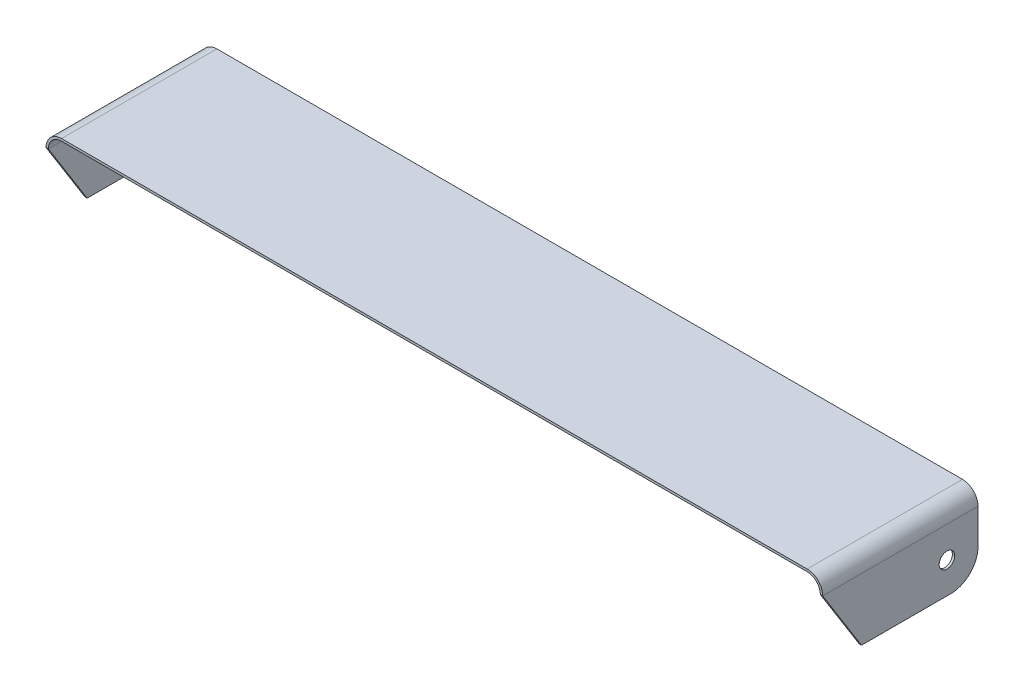
ISO-10303-21;
HEADER;
FILE_DESCRIPTION(('STEP AP214'),'2;1');
FILE_NAME('part.step','',(''),(''),'','','');
FILE_SCHEMA(('AUTOMOTIVE_DESIGN { 1 0 10303 214 1 1 1 1 }'));
ENDSEC;
DATA;
#1=APPLICATION_CONTEXT('core data for automotive mechanical design processes');
#2=APPLICATION_PROTOCOL_DEFINITION('international standard','automotive_design',2000,#1);
#3=PRODUCT_CONTEXT('',#1,'mechanical');
#4=PRODUCT('Part','Part','',(#3));
#5=PRODUCT_RELATED_PRODUCT_CATEGORY('part','',(#4));
#6=PRODUCT_DEFINITION_FORMATION('','',#4);
#7=PRODUCT_DEFINITION_CONTEXT('part definition',#1,'design');
#8=PRODUCT_DEFINITION('design','',#6,#7);
#9=PRODUCT_DEFINITION_SHAPE('','',#8);
#10=(LENGTH_UNIT() NAMED_UNIT(*) SI_UNIT(.MILLI.,.METRE.));
#11=(NAMED_UNIT(*) PLANE_ANGLE_UNIT() SI_UNIT($,.RADIAN.));
#12=(NAMED_UNIT(*) SI_UNIT($,.STERADIAN.) SOLID_ANGLE_UNIT());
#13=UNCERTAINTY_MEASURE_WITH_UNIT(LENGTH_MEASURE(1.E-05),#10,'distance_accuracy_value','');
#14=(GEOMETRIC_REPRESENTATION_CONTEXT(3) GLOBAL_UNCERTAINTY_ASSIGNED_CONTEXT((#13)) GLOBAL_UNIT_ASSIGNED_CONTEXT((#10,
#11,#12)) REPRESENTATION_CONTEXT('',''));
#15=CARTESIAN_POINT('',(0.,0.,0.));
#16=DIRECTION('',(0.,0.,1.));
#17=DIRECTION('',(1.,0.,0.));
#18=AXIS2_PLACEMENT_3D('',#15,#16,#17);
#19=CARTESIAN_POINT('',(-497.,171.973347917792,100.));
#20=DIRECTION('',(0.,1.,0.));
#21=DIRECTION('',(0.,0.,1.));
#22=AXIS2_PLACEMENT_3D('',#19,#20,#21);
#23=PLANE('',#22);
#24=DIRECTION('',(0.,0.,-1.));
#25=VECTOR('',#24,1.);
#26=CARTESIAN_POINT('',(-500.,171.973347917792,100.));
#27=LINE('',#26,#25);
#28=CARTESIAN_POINT('',(-500.,171.973347917793,50.));
#29=VERTEX_POINT('',#28);
#30=CARTESIAN_POINT('',(-500.,171.973347917792,-65.));
#31=VERTEX_POINT('',#30);
#32=EDGE_CURVE('E163',#29,#31,#27,.T.);
#33=ORIENTED_EDGE('',*,*,#32,.T.);
#34=DIRECTION('',(1.,0.,0.));
#35=VECTOR('',#34,1.);
#36=CARTESIAN_POINT('',(-497.,171.973347917792,-65.));
#37=LINE('',#36,#35);
#38=CARTESIAN_POINT('',(-497.,171.973347917792,-65.));
#39=VERTEX_POINT('',#38);
#40=EDGE_CURVE('E227',#31,#39,#37,.T.);
#41=ORIENTED_EDGE('',*,*,#40,.T.);
#42=DIRECTION('',(0.,0.,-1.));
#43=VECTOR('',#42,1.);
#44=CARTESIAN_POINT('',(-497.,171.973347917792,100.));
#45=LINE('',#44,#43);
#46=CARTESIAN_POINT('',(-497.,171.973347917793,50.));
#47=VERTEX_POINT('',#46);
#48=EDGE_CURVE('E166',#47,#39,#45,.T.);
#49=ORIENTED_EDGE('',*,*,#48,.F.);
#50=DIRECTION('',(1.,0.,0.));
#51=VECTOR('',#50,1.);
#52=CARTESIAN_POINT('',(-500.,171.973347917793,50.));
#53=LINE('',#52,#51);
#54=EDGE_CURVE('E147',#29,#47,#53,.T.);
#55=ORIENTED_EDGE('',*,*,#54,.F.);
#56=EDGE_LOOP('',(#33,#41,#49,#55));
#57=FACE_BOUND('',#56,.T.);
#58=ADVANCED_FACE('F43',(#57),#23,.F.);
#59=CARTESIAN_POINT('',(-497.,171.973347917792,100.));
#60=DIRECTION('',(-1.,0.,0.));
#61=DIRECTION('',(0.,0.,1.));
#62=AXIS2_PLACEMENT_3D('',#59,#60,#61);
#63=PLANE('',#62);
#64=CARTESIAN_POINT('',(-497.,211.973347917793,-60.));
#65=DIRECTION('',(-1.,0.,0.));
#66=DIRECTION('',(0.,0.,1.));
#67=AXIS2_PLACEMENT_3D('',#64,#65,#66);
#68=CIRCLE('',#67,10.);
#69=CARTESIAN_POINT('',(-497.,211.973347917793,-50.));
#70=VERTEX_POINT('',#69);
#71=EDGE_CURVE('E366',#70,#70,#68,.T.);
#72=ORIENTED_EDGE('',*,*,#71,.T.);
#73=EDGE_LOOP('',(#72));
#74=FACE_BOUND('',#73,.T.);
#75=ORIENTED_EDGE('',*,*,#48,.T.);
#76=CARTESIAN_POINT('',(-497.,206.973347917792,-65.));
#77=DIRECTION('',(-1.,0.,0.));
#78=DIRECTION('',(0.,0.,1.));
#79=AXIS2_PLACEMENT_3D('',#76,#77,#78);
#80=CIRCLE('',#79,35.);
#81=CARTESIAN_POINT('',(-497.,206.973347917792,-100.));
#82=VERTEX_POINT('',#81);
#83=EDGE_CURVE('E230',#39,#82,#80,.F.);
#84=ORIENTED_EDGE('',*,*,#83,.T.);
#85=DIRECTION('',(0.,1.,0.));
#86=VECTOR('',#85,1.);
#87=CARTESIAN_POINT('',(-497.,171.973347917792,-100.));
#88=LINE('',#87,#86);
#89=CARTESIAN_POINT('',(-497.,251.973347917792,-100.));
#90=VERTEX_POINT('',#89);
#91=EDGE_CURVE('E322',#82,#90,#88,.T.);
#92=ORIENTED_EDGE('',*,*,#91,.T.);
#93=DIRECTION('',(0.,0.,-1.));
#94=VECTOR('',#93,1.);
#95=CARTESIAN_POINT('',(-497.,251.973347917792,100.));
#96=LINE('',#95,#94);
#97=CARTESIAN_POINT('',(-497.,251.973347917792,100.));
#98=VERTEX_POINT('',#97);
#99=EDGE_CURVE('E217',#98,#90,#96,.T.);
#100=ORIENTED_EDGE('',*,*,#99,.F.);
#101=DIRECTION('',(0.,-0.847998304005088,-0.52999894000318));
#102=VECTOR('',#101,1.);
#103=CARTESIAN_POINT('',(-497.,194.445258030152,64.0449438202241));
#104=LINE('',#103,#102);
#105=EDGE_CURVE('E271',#98,#47,#104,.T.);
#106=ORIENTED_EDGE('',*,*,#105,.T.);
#107=EDGE_LOOP('',(#75,#84,#92,#100,#106));
#108=FACE_BOUND('',#107,.T.);
#109=ADVANCED_FACE('F338',(#74,#108),#63,.F.);
#110=CARTESIAN_POINT('',(-480.,251.973347917792,100.));
#111=DIRECTION('',(0.,0.,-1.));
#112=DIRECTION('',(-1.,0.,0.));
#113=AXIS2_PLACEMENT_3D('',#110,#111,#112);
#114=CYLINDRICAL_SURFACE('',#113,17.);
#115=CARTESIAN_POINT('',(-480.,251.973347917792,-100.));
#116=DIRECTION('',(0.,0.,-1.));
#117=DIRECTION('',(-1.,0.,0.));
#118=AXIS2_PLACEMENT_3D('',#115,#116,#117);
#119=CIRCLE('',#118,17.);
#120=CARTESIAN_POINT('',(-480.,268.973347917792,-100.));
#121=VERTEX_POINT('',#120);
#122=EDGE_CURVE('E294',#90,#121,#119,.T.);
#123=ORIENTED_EDGE('',*,*,#122,.T.);
#124=DIRECTION('',(0.,0.,-1.));
#125=VECTOR('',#124,1.);
#126=CARTESIAN_POINT('',(-480.,268.973347917792,100.));
#127=LINE('',#126,#125);
#128=CARTESIAN_POINT('',(-480.,268.973347917792,100.));
#129=VERTEX_POINT('',#128);
#130=EDGE_CURVE('E213',#129,#121,#127,.T.);
#131=ORIENTED_EDGE('',*,*,#130,.F.);
#132=CARTESIAN_POINT('',(-480.,251.973347917792,100.));
#133=DIRECTION('',(0.,0.,-1.));
#134=DIRECTION('',(-1.,0.,0.));
#135=AXIS2_PLACEMENT_3D('',#132,#133,#134);
#136=CIRCLE('',#135,17.);
#137=EDGE_CURVE('E308',#98,#129,#136,.T.);
#138=ORIENTED_EDGE('',*,*,#137,.F.);
#139=ORIENTED_EDGE('',*,*,#99,.T.);
#140=EDGE_LOOP('',(#123,#131,#138,#139));
#141=FACE_BOUND('',#140,.T.);
#142=ADVANCED_FACE('F327',(#141),#114,.F.);
#143=CARTESIAN_POINT('',(-480.,268.973347917792,100.));
#144=DIRECTION('',(0.,1.,0.));
#145=DIRECTION('',(0.,0.,1.));
#146=AXIS2_PLACEMENT_3D('',#143,#144,#145);
#147=PLANE('',#146);
#148=DIRECTION('',(1.,0.,0.));
#149=VECTOR('',#148,1.);
#150=CARTESIAN_POINT('',(-480.,268.973347917792,-100.));
#151=LINE('',#150,#149);
#152=CARTESIAN_POINT('',(480.,268.973347917792,-100.));
#153=VERTEX_POINT('',#152);
#154=EDGE_CURVE('E289',#121,#153,#151,.T.);
#155=ORIENTED_EDGE('',*,*,#154,.T.);
#156=DIRECTION('',(0.,0.,-1.));
#157=VECTOR('',#156,1.);
#158=CARTESIAN_POINT('',(480.,268.973347917792,100.));
#159=LINE('',#158,#157);
#160=CARTESIAN_POINT('',(480.,268.973347917792,100.));
#161=VERTEX_POINT('',#160);
#162=EDGE_CURVE('E209',#161,#153,#159,.T.);
#163=ORIENTED_EDGE('',*,*,#162,.F.);
#164=DIRECTION('',(1.,0.,0.));
#165=VECTOR('',#164,1.);
#166=CARTESIAN_POINT('',(-480.,268.973347917792,100.));
#167=LINE('',#166,#165);
#168=EDGE_CURVE('E278',#129,#161,#167,.T.);
#169=ORIENTED_EDGE('',*,*,#168,.F.);
#170=ORIENTED_EDGE('',*,*,#130,.T.);
#171=EDGE_LOOP('',(#155,#163,#169,#170));
#172=FACE_BOUND('',#171,.T.);
#173=ADVANCED_FACE('F330',(#172),#147,.F.);
#174=CARTESIAN_POINT('',(480.,251.973347917792,100.));
#175=DIRECTION('',(0.,0.,-1.));
#176=DIRECTION('',(-1.,0.,0.));
#177=AXIS2_PLACEMENT_3D('',#174,#175,#176);
#178=CYLINDRICAL_SURFACE('',#177,17.);
#179=CARTESIAN_POINT('',(480.,251.973347917792,-100.));
#180=DIRECTION('',(0.,0.,-1.));
#181=DIRECTION('',(-1.,0.,0.));
#182=AXIS2_PLACEMENT_3D('',#179,#180,#181);
#183=CIRCLE('',#182,17.);
#184=CARTESIAN_POINT('',(497.,251.973347917792,-100.));
#185=VERTEX_POINT('',#184);
#186=EDGE_CURVE('E286',#153,#185,#183,.T.);
#187=ORIENTED_EDGE('',*,*,#186,.T.);
#188=DIRECTION('',(0.,0.,-1.));
#189=VECTOR('',#188,1.);
#190=CARTESIAN_POINT('',(497.,251.973347917792,100.));
#191=LINE('',#190,#189);
#192=CARTESIAN_POINT('',(497.,251.973347917792,100.));
#193=VERTEX_POINT('',#192);
#194=EDGE_CURVE('E205',#193,#185,#191,.T.);
#195=ORIENTED_EDGE('',*,*,#194,.F.);
#196=CARTESIAN_POINT('',(480.,251.973347917792,100.));
#197=DIRECTION('',(0.,0.,-1.));
#198=DIRECTION('',(-1.,0.,0.));
#199=AXIS2_PLACEMENT_3D('',#196,#197,#198);
#200=CIRCLE('',#199,17.);
#201=EDGE_CURVE('E275',#161,#193,#200,.T.);
#202=ORIENTED_EDGE('',*,*,#201,.F.);
#203=ORIENTED_EDGE('',*,*,#162,.T.);
#204=EDGE_LOOP('',(#187,#195,#202,#203));
#205=FACE_BOUND('',#204,.T.);
#206=ADVANCED_FACE('F284',(#205),#178,.F.);
#207=CARTESIAN_POINT('',(497.,251.973347917792,100.));
#208=DIRECTION('',(1.,0.,0.));
#209=DIRECTION('',(0.,0.,-1.));
#210=AXIS2_PLACEMENT_3D('',#207,#208,#209);
#211=PLANE('',#210);
#212=CARTESIAN_POINT('',(497.,211.973347917792,-60.));
#213=DIRECTION('',(1.,0.,0.));
#214=DIRECTION('',(0.,0.,-1.));
#215=AXIS2_PLACEMENT_3D('',#212,#213,#214);
#216=CIRCLE('',#215,10.);
#217=CARTESIAN_POINT('',(497.,211.973347917792,-70.));
#218=VERTEX_POINT('',#217);
#219=EDGE_CURVE('E370',#218,#218,#216,.T.);
#220=ORIENTED_EDGE('',*,*,#219,.T.);
#221=EDGE_LOOP('',(#220));
#222=FACE_BOUND('',#221,.T.);
#223=DIRECTION('',(0.,-1.,0.));
#224=VECTOR('',#223,1.);
#225=CARTESIAN_POINT('',(497.,251.973347917792,-100.));
#226=LINE('',#225,#224);
#227=CARTESIAN_POINT('',(497.,206.973347917792,-100.));
#228=VERTEX_POINT('',#227);
#229=EDGE_CURVE('E259',#185,#228,#226,.T.);
#230=ORIENTED_EDGE('',*,*,#229,.T.);
#231=CARTESIAN_POINT('',(497.,206.973347917792,-65.));
#232=DIRECTION('',(1.,0.,0.));
#233=DIRECTION('',(0.,0.,-1.));
#234=AXIS2_PLACEMENT_3D('',#231,#232,#233);
#235=CIRCLE('',#234,35.);
#236=CARTESIAN_POINT('',(497.,171.973347917792,-65.));
#237=VERTEX_POINT('',#236);
#238=EDGE_CURVE('E11',#228,#237,#235,.F.);
#239=ORIENTED_EDGE('',*,*,#238,.T.);
#240=DIRECTION('',(0.,0.,-1.));
#241=VECTOR('',#240,1.);
#242=CARTESIAN_POINT('',(497.,171.973347917792,100.));
#243=LINE('',#242,#241);
#244=CARTESIAN_POINT('',(497.,171.973347917792,50.));
#245=VERTEX_POINT('',#244);
#246=EDGE_CURVE('E202',#245,#237,#243,.T.);
#247=ORIENTED_EDGE('',*,*,#246,.F.);
#248=DIRECTION('',(0.,0.847998304005088,0.52999894000318));
#249=VECTOR('',#248,1.);
#250=CARTESIAN_POINT('',(497.,251.973347917792,99.9999999999999));
#251=LINE('',#250,#249);
#252=EDGE_CURVE('E266',#245,#193,#251,.T.);
#253=ORIENTED_EDGE('',*,*,#252,.T.);
#254=ORIENTED_EDGE('',*,*,#194,.T.);
#255=EDGE_LOOP('',(#230,#239,#247,#253,#254));
#256=FACE_BOUND('',#255,.T.);
#257=ADVANCED_FACE('F265',(#222,#256),#211,.F.);
#258=CARTESIAN_POINT('',(500.,171.973347917792,100.));
#259=DIRECTION('',(0.,1.,0.));
#260=DIRECTION('',(0.,0.,1.));
#261=AXIS2_PLACEMENT_3D('',#258,#259,#260);
#262=PLANE('',#261);
#263=ORIENTED_EDGE('',*,*,#246,.T.);
#264=DIRECTION('',(1.,0.,0.));
#265=VECTOR('',#264,1.);
#266=CARTESIAN_POINT('',(500.,171.973347917792,-65.));
#267=LINE('',#266,#265);
#268=CARTESIAN_POINT('',(500.,171.973347917792,-65.));
#269=VERTEX_POINT('',#268);
#270=EDGE_CURVE('E241',#237,#269,#267,.T.);
#271=ORIENTED_EDGE('',*,*,#270,.T.);
#272=DIRECTION('',(0.,0.,-1.));
#273=VECTOR('',#272,1.);
#274=CARTESIAN_POINT('',(500.,171.973347917792,100.));
#275=LINE('',#274,#273);
#276=CARTESIAN_POINT('',(500.,171.973347917792,50.));
#277=VERTEX_POINT('',#276);
#278=EDGE_CURVE('E198',#277,#269,#275,.T.);
#279=ORIENTED_EDGE('',*,*,#278,.F.);
#280=EDGE_CURVE('E156',#245,#277,#53,.T.);
#281=ORIENTED_EDGE('',*,*,#280,.F.);
#282=EDGE_LOOP('',(#263,#271,#279,#281));
#283=FACE_BOUND('',#282,.T.);
#284=ADVANCED_FACE('F262',(#283),#262,.F.);
#285=CARTESIAN_POINT('',(500.,251.973347917792,100.));
#286=DIRECTION('',(-1.,0.,0.));
#287=DIRECTION('',(0.,-1.,0.));
#288=AXIS2_PLACEMENT_3D('',#285,#286,#287);
#289=PLANE('',#288);
#290=CARTESIAN_POINT('',(500.,211.973347917792,-60.));
#291=DIRECTION('',(1.,0.,0.));
#292=DIRECTION('',(0.,1.,0.));
#293=AXIS2_PLACEMENT_3D('',#290,#291,#292);
#294=CIRCLE('',#293,10.);
#295=CARTESIAN_POINT('',(500.,221.973347917792,-60.));
#296=VERTEX_POINT('',#295);
#297=EDGE_CURVE('E378',#296,#296,#294,.T.);
#298=ORIENTED_EDGE('',*,*,#297,.F.);
#299=EDGE_LOOP('',(#298));
#300=FACE_BOUND('',#299,.T.);
#301=ORIENTED_EDGE('',*,*,#278,.T.);
#302=CARTESIAN_POINT('',(500.,206.973347917792,-65.));
#303=DIRECTION('',(-1.,0.,0.));
#304=DIRECTION('',(0.,-1.,0.));
#305=AXIS2_PLACEMENT_3D('',#302,#303,#304);
#306=CIRCLE('',#305,35.);
#307=CARTESIAN_POINT('',(500.,206.973347917792,-100.));
#308=VERTEX_POINT('',#307);
#309=EDGE_CURVE('E52',#269,#308,#306,.F.);
#310=ORIENTED_EDGE('',*,*,#309,.T.);
#311=DIRECTION('',(0.,1.,0.));
#312=VECTOR('',#311,1.);
#313=CARTESIAN_POINT('',(500.,251.973347917792,-100.));
#314=LINE('',#313,#312);
#315=CARTESIAN_POINT('',(500.,251.973347917792,-100.));
#316=VERTEX_POINT('',#315);
#317=EDGE_CURVE('E248',#308,#316,#314,.T.);
#318=ORIENTED_EDGE('',*,*,#317,.T.);
#319=DIRECTION('',(0.,0.,-1.));
#320=VECTOR('',#319,1.);
#321=CARTESIAN_POINT('',(500.,251.973347917792,100.));
#322=LINE('',#321,#320);
#323=CARTESIAN_POINT('',(500.,251.973347917792,100.));
#324=VERTEX_POINT('',#323);
#325=EDGE_CURVE('E194',#324,#316,#322,.T.);
#326=ORIENTED_EDGE('',*,*,#325,.F.);
#327=DIRECTION('',(0.,0.847998304005088,0.52999894000318));
#328=VECTOR('',#327,1.);
#329=CARTESIAN_POINT('',(500.,171.973347917792,50.));
#330=LINE('',#329,#328);
#331=EDGE_CURVE('E157',#277,#324,#330,.T.);
#332=ORIENTED_EDGE('',*,*,#331,.F.);
#333=EDGE_LOOP('',(#301,#310,#318,#326,#332));
#334=FACE_BOUND('',#333,.T.);
#335=ADVANCED_FACE('F246',(#300,#334),#289,.F.);
#336=CARTESIAN_POINT('',(480.,251.973347917792,100.));
#337=DIRECTION('',(0.,0.,-1.));
#338=DIRECTION('',(-1.,0.,0.));
#339=AXIS2_PLACEMENT_3D('',#336,#337,#338);
#340=CYLINDRICAL_SURFACE('',#339,20.);
#341=CARTESIAN_POINT('',(480.,251.973347917792,-100.));
#342=DIRECTION('',(0.,0.,1.));
#343=DIRECTION('',(-1.,0.,0.));
#344=AXIS2_PLACEMENT_3D('',#341,#342,#343);
#345=CIRCLE('',#344,20.);
#346=CARTESIAN_POINT('',(480.,271.973347917792,-100.));
#347=VERTEX_POINT('',#346);
#348=EDGE_CURVE('E257',#316,#347,#345,.T.);
#349=ORIENTED_EDGE('',*,*,#348,.T.);
#350=DIRECTION('',(0.,0.,-1.));
#351=VECTOR('',#350,1.);
#352=CARTESIAN_POINT('',(480.,271.973347917792,100.));
#353=LINE('',#352,#351);
#354=CARTESIAN_POINT('',(480.,271.973347917792,100.));
#355=VERTEX_POINT('',#354);
#356=EDGE_CURVE('E190',#355,#347,#353,.T.);
#357=ORIENTED_EDGE('',*,*,#356,.F.);
#358=CARTESIAN_POINT('',(480.,251.973347917792,100.));
#359=DIRECTION('',(0.,0.,1.));
#360=DIRECTION('',(-1.,0.,0.));
#361=AXIS2_PLACEMENT_3D('',#358,#359,#360);
#362=CIRCLE('',#361,20.);
#363=EDGE_CURVE('E282',#324,#355,#362,.T.);
#364=ORIENTED_EDGE('',*,*,#363,.F.);
#365=ORIENTED_EDGE('',*,*,#325,.T.);
#366=EDGE_LOOP('',(#349,#357,#364,#365));
#367=FACE_BOUND('',#366,.T.);
#368=ADVANCED_FACE('F386',(#367),#340,.T.);
#369=CARTESIAN_POINT('',(-480.,271.973347917792,100.));
#370=DIRECTION('',(0.,-1.,0.));
#371=DIRECTION('',(0.,0.,-1.));
#372=AXIS2_PLACEMENT_3D('',#369,#370,#371);
#373=PLANE('',#372);
#374=DIRECTION('',(-1.,0.,0.));
#375=VECTOR('',#374,1.);
#376=CARTESIAN_POINT('',(-480.,271.973347917792,-100.));
#377=LINE('',#376,#375);
#378=CARTESIAN_POINT('',(-480.,271.973347917792,-100.));
#379=VERTEX_POINT('',#378);
#380=EDGE_CURVE('E300',#347,#379,#377,.T.);
#381=ORIENTED_EDGE('',*,*,#380,.T.);
#382=DIRECTION('',(0.,0.,-1.));
#383=VECTOR('',#382,1.);
#384=CARTESIAN_POINT('',(-480.,271.973347917792,100.));
#385=LINE('',#384,#383);
#386=CARTESIAN_POINT('',(-480.,271.973347917792,100.));
#387=VERTEX_POINT('',#386);
#388=EDGE_CURVE('E179',#387,#379,#385,.T.);
#389=ORIENTED_EDGE('',*,*,#388,.F.);
#390=DIRECTION('',(-1.,0.,0.));
#391=VECTOR('',#390,1.);
#392=CARTESIAN_POINT('',(-480.,271.973347917792,100.));
#393=LINE('',#392,#391);
#394=EDGE_CURVE('E181',#355,#387,#393,.T.);
#395=ORIENTED_EDGE('',*,*,#394,.F.);
#396=ORIENTED_EDGE('',*,*,#356,.T.);
#397=EDGE_LOOP('',(#381,#389,#395,#396));
#398=FACE_BOUND('',#397,.T.);
#399=ADVANCED_FACE('F392',(#398),#373,.F.);
#400=CARTESIAN_POINT('',(-480.,251.973347917792,100.));
#401=DIRECTION('',(0.,0.,-1.));
#402=DIRECTION('',(-1.,0.,0.));
#403=AXIS2_PLACEMENT_3D('',#400,#401,#402);
#404=CYLINDRICAL_SURFACE('',#403,20.);
#405=CARTESIAN_POINT('',(-480.,251.973347917792,-100.));
#406=DIRECTION('',(0.,0.,1.));
#407=DIRECTION('',(-1.,0.,0.));
#408=AXIS2_PLACEMENT_3D('',#405,#406,#407);
#409=CIRCLE('',#408,20.);
#410=CARTESIAN_POINT('',(-500.,251.973347917792,-100.));
#411=VERTEX_POINT('',#410);
#412=EDGE_CURVE('E302',#379,#411,#409,.T.);
#413=ORIENTED_EDGE('',*,*,#412,.T.);
#414=DIRECTION('',(0.,0.,-1.));
#415=VECTOR('',#414,1.);
#416=CARTESIAN_POINT('',(-500.,251.973347917792,100.));
#417=LINE('',#416,#415);
#418=CARTESIAN_POINT('',(-500.,251.973347917793,100.));
#419=VERTEX_POINT('',#418);
#420=EDGE_CURVE('E174',#419,#411,#417,.T.);
#421=ORIENTED_EDGE('',*,*,#420,.F.);
#422=CARTESIAN_POINT('',(-480.,251.973347917792,100.));
#423=DIRECTION('',(0.,0.,1.));
#424=DIRECTION('',(-1.,0.,0.));
#425=AXIS2_PLACEMENT_3D('',#422,#423,#424);
#426=CIRCLE('',#425,20.);
#427=EDGE_CURVE('E175',#387,#419,#426,.T.);
#428=ORIENTED_EDGE('',*,*,#427,.F.);
#429=ORIENTED_EDGE('',*,*,#388,.T.);
#430=EDGE_LOOP('',(#413,#421,#428,#429));
#431=FACE_BOUND('',#430,.T.);
#432=ADVANCED_FACE('F426',(#431),#404,.T.);
#433=CARTESIAN_POINT('',(-500.,171.973347917792,100.));
#434=DIRECTION('',(1.,0.,0.));
#435=DIRECTION('',(0.,0.,-1.));
#436=AXIS2_PLACEMENT_3D('',#433,#434,#435);
#437=PLANE('',#436);
#438=CARTESIAN_POINT('',(-500.,211.973347917793,-60.));
#439=DIRECTION('',(1.,0.,0.));
#440=DIRECTION('',(0.,1.,0.));
#441=AXIS2_PLACEMENT_3D('',#438,#439,#440);
#442=CIRCLE('',#441,10.);
#443=CARTESIAN_POINT('',(-500.,221.973347917793,-60.));
#444=VERTEX_POINT('',#443);
#445=EDGE_CURVE('E374',#444,#444,#442,.T.);
#446=ORIENTED_EDGE('',*,*,#445,.T.);
#447=EDGE_LOOP('',(#446));
#448=FACE_BOUND('',#447,.T.);
#449=DIRECTION('',(0.,-1.,0.));
#450=VECTOR('',#449,1.);
#451=CARTESIAN_POINT('',(-500.,171.973347917792,-100.));
#452=LINE('',#451,#450);
#453=CARTESIAN_POINT('',(-500.,206.973347917792,-100.));
#454=VERTEX_POINT('',#453);
#455=EDGE_CURVE('E184',#411,#454,#452,.T.);
#456=ORIENTED_EDGE('',*,*,#455,.T.);
#457=CARTESIAN_POINT('',(-500.,206.973347917792,-65.));
#458=DIRECTION('',(1.,0.,0.));
#459=DIRECTION('',(0.,0.,-1.));
#460=AXIS2_PLACEMENT_3D('',#457,#458,#459);
#461=CIRCLE('',#460,35.);
#462=EDGE_CURVE('E172',#454,#31,#461,.F.);
#463=ORIENTED_EDGE('',*,*,#462,.T.);
#464=ORIENTED_EDGE('',*,*,#32,.F.);
#465=DIRECTION('',(0.,0.847998304005088,0.52999894000318));
#466=VECTOR('',#465,1.);
#467=CARTESIAN_POINT('',(-500.,171.973347917793,50.));
#468=LINE('',#467,#466);
#469=EDGE_CURVE('E144',#29,#419,#468,.T.);
#470=ORIENTED_EDGE('',*,*,#469,.T.);
#471=ORIENTED_EDGE('',*,*,#420,.T.);
#472=EDGE_LOOP('',(#456,#463,#464,#470,#471));
#473=FACE_BOUND('',#472,.T.);
#474=ADVANCED_FACE('F170',(#448,#473),#437,.F.);
#475=CARTESIAN_POINT('',(-480.,251.973347917792,100.));
#476=DIRECTION('',(0.,0.,-1.));
#477=DIRECTION('',(-1.,0.,0.));
#478=AXIS2_PLACEMENT_3D('',#475,#476,#477);
#479=PLANE('',#478);
#480=ORIENTED_EDGE('',*,*,#427,.T.);
#481=DIRECTION('',(1.,0.,0.));
#482=VECTOR('',#481,1.);
#483=CARTESIAN_POINT('',(-500.,251.973347917793,100.));
#484=LINE('',#483,#482);
#485=EDGE_CURVE('E150',#419,#98,#484,.T.);
#486=ORIENTED_EDGE('',*,*,#485,.T.);
#487=ORIENTED_EDGE('',*,*,#137,.T.);
#488=ORIENTED_EDGE('',*,*,#168,.T.);
#489=ORIENTED_EDGE('',*,*,#201,.T.);
#490=DIRECTION('',(1.,0.,0.));
#491=VECTOR('',#490,1.);
#492=CARTESIAN_POINT('',(-480.,251.973347917793,100.));
#493=LINE('',#492,#491);
#494=EDGE_CURVE('E223',#193,#324,#493,.T.);
#495=ORIENTED_EDGE('',*,*,#494,.T.);
#496=ORIENTED_EDGE('',*,*,#363,.T.);
#497=ORIENTED_EDGE('',*,*,#394,.T.);
#498=EDGE_LOOP('',(#480,#486,#487,#488,#489,#495,#496,#497));
#499=FACE_BOUND('',#498,.T.);
#500=ADVANCED_FACE('F276',(#499),#479,.F.);
#501=CARTESIAN_POINT('',(-480.,251.973347917792,-100.));
#502=DIRECTION('',(0.,0.,-1.));
#503=DIRECTION('',(-1.,0.,0.));
#504=AXIS2_PLACEMENT_3D('',#501,#502,#503);
#505=PLANE('',#504);
#506=ORIENTED_EDGE('',*,*,#91,.F.);
#507=DIRECTION('',(1.,0.,0.));
#508=VECTOR('',#507,1.);
#509=CARTESIAN_POINT('',(-500.,206.973347917792,-100.));
#510=LINE('',#509,#508);
#511=EDGE_CURVE('E236',#82,#454,#510,.F.);
#512=ORIENTED_EDGE('',*,*,#511,.T.);
#513=ORIENTED_EDGE('',*,*,#455,.F.);
#514=ORIENTED_EDGE('',*,*,#412,.F.);
#515=ORIENTED_EDGE('',*,*,#380,.F.);
#516=ORIENTED_EDGE('',*,*,#348,.F.);
#517=ORIENTED_EDGE('',*,*,#317,.F.);
#518=DIRECTION('',(1.,0.,0.));
#519=VECTOR('',#518,1.);
#520=CARTESIAN_POINT('',(497.,206.973347917792,-100.));
#521=LINE('',#520,#519);
#522=EDGE_CURVE('E233',#308,#228,#521,.F.);
#523=ORIENTED_EDGE('',*,*,#522,.T.);
#524=ORIENTED_EDGE('',*,*,#229,.F.);
#525=ORIENTED_EDGE('',*,*,#186,.F.);
#526=ORIENTED_EDGE('',*,*,#154,.F.);
#527=ORIENTED_EDGE('',*,*,#122,.F.);
#528=EDGE_LOOP('',(#506,#512,#513,#514,#515,#516,#517,#523,#524,#525,#526,#527));
#529=FACE_BOUND('',#528,.T.);
#530=ADVANCED_FACE('F254',(#529),#505,.T.);
#531=CARTESIAN_POINT('',(-500.,171.973347917793,50.));
#532=DIRECTION('',(0.,0.52999894000318,-0.847998304005088));
#533=DIRECTION('',(0.,0.847998304005088,0.52999894000318));
#534=AXIS2_PLACEMENT_3D('',#531,#532,#533);
#535=PLANE('',#534);
#536=ORIENTED_EDGE('',*,*,#280,.T.);
#537=ORIENTED_EDGE('',*,*,#331,.T.);
#538=ORIENTED_EDGE('',*,*,#494,.F.);
#539=ORIENTED_EDGE('',*,*,#252,.F.);
#540=EDGE_LOOP('',(#536,#537,#538,#539));
#541=FACE_BOUND('',#540,.T.);
#542=ADVANCED_FACE('F440',(#541),#535,.F.);
#543=ORIENTED_EDGE('',*,*,#485,.F.);
#544=ORIENTED_EDGE('',*,*,#469,.F.);
#545=ORIENTED_EDGE('',*,*,#54,.T.);
#546=ORIENTED_EDGE('',*,*,#105,.F.);
#547=EDGE_LOOP('',(#543,#544,#545,#546));
#548=FACE_BOUND('',#547,.T.);
#549=ADVANCED_FACE('F146',(#548),#535,.F.);
#550=CARTESIAN_POINT('',(-500.,211.973347917793,-60.));
#551=DIRECTION('',(1.,0.,0.));
#552=DIRECTION('',(0.,1.,0.));
#553=AXIS2_PLACEMENT_3D('',#550,#551,#552);
#554=CYLINDRICAL_SURFACE('',#553,10.);
#555=ORIENTED_EDGE('',*,*,#445,.F.);
#556=EDGE_LOOP('',(#555));
#557=FACE_BOUND('',#556,.T.);
#558=ORIENTED_EDGE('',*,*,#71,.F.);
#559=EDGE_LOOP('',(#558));
#560=FACE_BOUND('',#559,.T.);
#561=ADVANCED_FACE('F355',(#557,#560),#554,.F.);
#562=ORIENTED_EDGE('',*,*,#297,.T.);
#563=EDGE_LOOP('',(#562));
#564=FACE_BOUND('',#563,.T.);
#565=ORIENTED_EDGE('',*,*,#219,.F.);
#566=EDGE_LOOP('',(#565));
#567=FACE_BOUND('',#566,.T.);
#568=ADVANCED_FACE('F349',(#564,#567),#554,.F.);
#569=CARTESIAN_POINT('',(-497.,206.973347917792,-65.));
#570=DIRECTION('',(-1.,0.,0.));
#571=DIRECTION('',(0.,0.,1.));
#572=AXIS2_PLACEMENT_3D('',#569,#570,#571);
#573=CYLINDRICAL_SURFACE('',#572,35.);
#574=ORIENTED_EDGE('',*,*,#462,.F.);
#575=ORIENTED_EDGE('',*,*,#511,.F.);
#576=ORIENTED_EDGE('',*,*,#83,.F.);
#577=ORIENTED_EDGE('',*,*,#40,.F.);
#578=EDGE_LOOP('',(#574,#575,#576,#577));
#579=FACE_BOUND('',#578,.T.);
#580=ADVANCED_FACE('F347',(#579),#573,.T.);
#581=CARTESIAN_POINT('',(500.,206.973347917792,-65.));
#582=DIRECTION('',(-1.,0.,0.));
#583=DIRECTION('',(0.,0.,1.));
#584=AXIS2_PLACEMENT_3D('',#581,#582,#583);
#585=CYLINDRICAL_SURFACE('',#584,35.);
#586=ORIENTED_EDGE('',*,*,#238,.F.);
#587=ORIENTED_EDGE('',*,*,#522,.F.);
#588=ORIENTED_EDGE('',*,*,#309,.F.);
#589=ORIENTED_EDGE('',*,*,#270,.F.);
#590=EDGE_LOOP('',(#586,#587,#588,#589));
#591=FACE_BOUND('',#590,.T.);
#592=ADVANCED_FACE('F45',(#591),#585,.T.);
#593=CLOSED_SHELL('',(#58,#109,#142,#173,#206,#257,#284,#335,#368,#399,#432,#474,#500,#530,#542,
#549,#561,#568,#580,#592));
#594=MANIFOLD_SOLID_BREP('B2',#593);
#595=ADVANCED_BREP_SHAPE_REPRESENTATION('',(#18,#594),#14);
#596=SHAPE_DEFINITION_REPRESENTATION(#9,#595);
ENDSEC;
END-ISO-10303-21;
